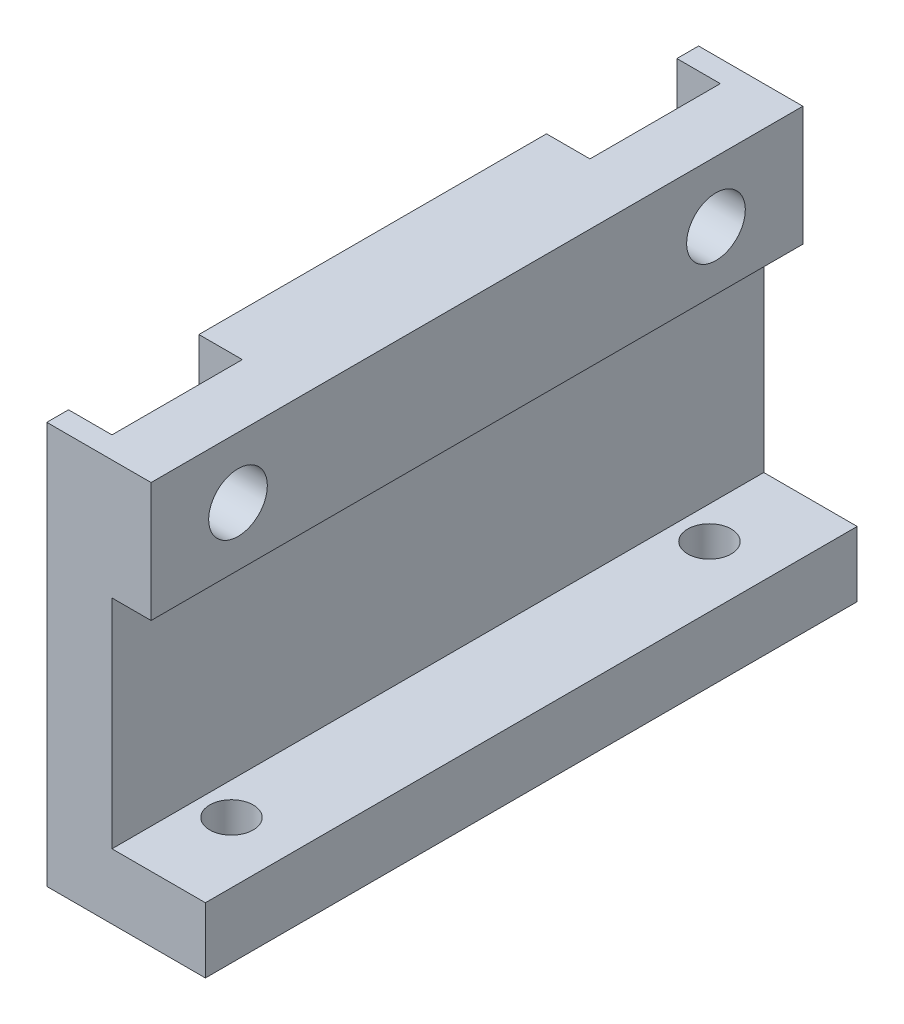
ISO-10303-21;
HEADER;
FILE_DESCRIPTION(('STEP AP214'),'2;1');
FILE_NAME('part.step','',(''),(''),'','','');
FILE_SCHEMA(('AUTOMOTIVE_DESIGN { 1 0 10303 214 1 1 1 1 }'));
ENDSEC;
DATA;
#1=APPLICATION_CONTEXT('core data for automotive mechanical design processes');
#2=APPLICATION_PROTOCOL_DEFINITION('international standard','automotive_design',2000,#1);
#3=PRODUCT_CONTEXT('',#1,'mechanical');
#4=PRODUCT('Part','Part','',(#3));
#5=PRODUCT_RELATED_PRODUCT_CATEGORY('part','',(#4));
#6=PRODUCT_DEFINITION_FORMATION('','',#4);
#7=PRODUCT_DEFINITION_CONTEXT('part definition',#1,'design');
#8=PRODUCT_DEFINITION('design','',#6,#7);
#9=PRODUCT_DEFINITION_SHAPE('','',#8);
#10=(LENGTH_UNIT() NAMED_UNIT(*) SI_UNIT(.MILLI.,.METRE.));
#11=(NAMED_UNIT(*) PLANE_ANGLE_UNIT() SI_UNIT($,.RADIAN.));
#12=(NAMED_UNIT(*) SI_UNIT($,.STERADIAN.) SOLID_ANGLE_UNIT());
#13=UNCERTAINTY_MEASURE_WITH_UNIT(LENGTH_MEASURE(1.E-05),#10,'distance_accuracy_value','');
#14=(GEOMETRIC_REPRESENTATION_CONTEXT(3) GLOBAL_UNCERTAINTY_ASSIGNED_CONTEXT((#13)) GLOBAL_UNIT_ASSIGNED_CONTEXT((#10,
#11,#12)) REPRESENTATION_CONTEXT('',''));
#15=CARTESIAN_POINT('',(0.,0.,0.));
#16=DIRECTION('',(0.,0.,1.));
#17=DIRECTION('',(1.,0.,0.));
#18=AXIS2_PLACEMENT_3D('',#15,#16,#17);
#19=CARTESIAN_POINT('',(7.301,15.7,4.));
#20=DIRECTION('',(-1.,0.,0.));
#21=DIRECTION('',(0.,-1.,0.));
#22=AXIS2_PLACEMENT_3D('',#19,#20,#21);
#23=CYLINDRICAL_SURFACE('',#22,1.35);
#24=CARTESIAN_POINT('',(4.8,15.7,4.));
#25=DIRECTION('',(-1.,0.,0.));
#26=DIRECTION('',(0.,-1.,0.));
#27=AXIS2_PLACEMENT_3D('',#24,#25,#26);
#28=CIRCLE('',#27,1.35);
#29=CARTESIAN_POINT('',(4.8,14.35,4.));
#30=VERTEX_POINT('',#29);
#31=EDGE_CURVE('E202',#30,#30,#28,.F.);
#32=ORIENTED_EDGE('',*,*,#31,.T.);
#33=EDGE_LOOP('',(#32));
#34=FACE_BOUND('',#33,.T.);
#35=CARTESIAN_POINT('',(2.,15.7,4.));
#36=DIRECTION('',(-1.,0.,0.));
#37=DIRECTION('',(0.,-1.,0.));
#38=AXIS2_PLACEMENT_3D('',#35,#36,#37);
#39=CIRCLE('',#38,1.35);
#40=CARTESIAN_POINT('',(2.,14.35,4.));
#41=VERTEX_POINT('',#40);
#42=EDGE_CURVE('E175',#41,#41,#39,.F.);
#43=ORIENTED_EDGE('',*,*,#42,.F.);
#44=EDGE_LOOP('',(#43));
#45=FACE_BOUND('',#44,.T.);
#46=ADVANCED_FACE('F34',(#34,#45),#23,.F.);
#47=CARTESIAN_POINT('',(7.301,15.7,26.));
#48=DIRECTION('',(-1.,0.,0.));
#49=DIRECTION('',(0.,-1.,0.));
#50=AXIS2_PLACEMENT_3D('',#47,#48,#49);
#51=CYLINDRICAL_SURFACE('',#50,1.35);
#52=CARTESIAN_POINT('',(4.8,15.7,26.));
#53=DIRECTION('',(-1.,0.,0.));
#54=DIRECTION('',(0.,-1.,0.));
#55=AXIS2_PLACEMENT_3D('',#52,#53,#54);
#56=CIRCLE('',#55,1.35);
#57=CARTESIAN_POINT('',(4.8,14.35,26.));
#58=VERTEX_POINT('',#57);
#59=EDGE_CURVE('E199',#58,#58,#56,.F.);
#60=ORIENTED_EDGE('',*,*,#59,.T.);
#61=EDGE_LOOP('',(#60));
#62=FACE_BOUND('',#61,.T.);
#63=CARTESIAN_POINT('',(2.,15.7,26.));
#64=DIRECTION('',(-1.,0.,0.));
#65=DIRECTION('',(0.,-1.,0.));
#66=AXIS2_PLACEMENT_3D('',#63,#64,#65);
#67=CIRCLE('',#66,1.35);
#68=CARTESIAN_POINT('',(2.,14.35,26.));
#69=VERTEX_POINT('',#68);
#70=EDGE_CURVE('E195',#69,#69,#67,.F.);
#71=ORIENTED_EDGE('',*,*,#70,.F.);
#72=EDGE_LOOP('',(#71));
#73=FACE_BOUND('',#72,.T.);
#74=ADVANCED_FACE('F339',(#62,#73),#51,.F.);
#75=CARTESIAN_POINT('',(0.,18.5,30.));
#76=DIRECTION('',(1.,0.,0.));
#77=DIRECTION('',(0.,1.,0.));
#78=AXIS2_PLACEMENT_3D('',#75,#76,#77);
#79=PLANE('',#78);
#80=CARTESIAN_POINT('',(0.,15.7,4.));
#81=DIRECTION('',(-1.,0.,0.));
#82=DIRECTION('',(0.,-1.,0.));
#83=AXIS2_PLACEMENT_3D('',#80,#81,#82);
#84=CIRCLE('',#83,3.);
#85=CARTESIAN_POINT('',(0.,15.7,0.999999999999997));
#86=VERTEX_POINT('',#85);
#87=CARTESIAN_POINT('',(0.,15.7,7.));
#88=VERTEX_POINT('',#87);
#89=EDGE_CURVE('E154',#86,#88,#84,.T.);
#90=ORIENTED_EDGE('',*,*,#89,.F.);
#91=DIRECTION('',(0.,-1.,0.));
#92=VECTOR('',#91,1.);
#93=CARTESIAN_POINT('',(0.,15.7,0.999999999999997));
#94=LINE('',#93,#92);
#95=CARTESIAN_POINT('',(0.,18.5,0.999999999999997));
#96=VERTEX_POINT('',#95);
#97=EDGE_CURVE('E167',#96,#86,#94,.T.);
#98=ORIENTED_EDGE('',*,*,#97,.F.);
#99=DIRECTION('',(0.,0.,-1.));
#100=VECTOR('',#99,1.);
#101=CARTESIAN_POINT('',(0.,18.5,30.));
#102=LINE('',#101,#100);
#103=CARTESIAN_POINT('',(0.,18.5,0.));
#104=VERTEX_POINT('',#103);
#105=EDGE_CURVE('E236',#96,#104,#102,.T.);
#106=ORIENTED_EDGE('',*,*,#105,.T.);
#107=DIRECTION('',(0.,-1.,0.));
#108=VECTOR('',#107,1.);
#109=CARTESIAN_POINT('',(0.,18.5,0.));
#110=LINE('',#109,#108);
#111=CARTESIAN_POINT('',(0.,0.,0.));
#112=VERTEX_POINT('',#111);
#113=EDGE_CURVE('E215',#104,#112,#110,.T.);
#114=ORIENTED_EDGE('',*,*,#113,.T.);
#115=DIRECTION('',(0.,0.,-1.));
#116=VECTOR('',#115,1.);
#117=CARTESIAN_POINT('',(0.,0.,30.));
#118=LINE('',#117,#116);
#119=CARTESIAN_POINT('',(0.,0.,30.));
#120=VERTEX_POINT('',#119);
#121=EDGE_CURVE('E275',#120,#112,#118,.T.);
#122=ORIENTED_EDGE('',*,*,#121,.F.);
#123=DIRECTION('',(0.,-1.,0.));
#124=VECTOR('',#123,1.);
#125=CARTESIAN_POINT('',(0.,18.5,30.));
#126=LINE('',#125,#124);
#127=CARTESIAN_POINT('',(0.,18.5,30.));
#128=VERTEX_POINT('',#127);
#129=EDGE_CURVE('E218',#128,#120,#126,.T.);
#130=ORIENTED_EDGE('',*,*,#129,.F.);
#131=CARTESIAN_POINT('',(0.,18.5,29.));
#132=VERTEX_POINT('',#131);
#133=EDGE_CURVE('E253',#128,#132,#102,.T.);
#134=ORIENTED_EDGE('',*,*,#133,.T.);
#135=DIRECTION('',(0.,1.,0.));
#136=VECTOR('',#135,1.);
#137=CARTESIAN_POINT('',(0.,20.0068838464239,29.));
#138=LINE('',#137,#136);
#139=CARTESIAN_POINT('',(0.,15.7,29.));
#140=VERTEX_POINT('',#139);
#141=EDGE_CURVE('E189',#140,#132,#138,.T.);
#142=ORIENTED_EDGE('',*,*,#141,.F.);
#143=CARTESIAN_POINT('',(0.,15.7,26.));
#144=DIRECTION('',(-1.,0.,0.));
#145=DIRECTION('',(0.,-1.,0.));
#146=AXIS2_PLACEMENT_3D('',#143,#144,#145);
#147=CIRCLE('',#146,3.);
#148=CARTESIAN_POINT('',(0.,15.7,23.));
#149=VERTEX_POINT('',#148);
#150=EDGE_CURVE('E179',#149,#140,#147,.T.);
#151=ORIENTED_EDGE('',*,*,#150,.F.);
#152=DIRECTION('',(0.,-1.,0.));
#153=VECTOR('',#152,1.);
#154=CARTESIAN_POINT('',(0.,15.7,23.));
#155=LINE('',#154,#153);
#156=CARTESIAN_POINT('',(0.,18.5,23.));
#157=VERTEX_POINT('',#156);
#158=EDGE_CURVE('E182',#157,#149,#155,.T.);
#159=ORIENTED_EDGE('',*,*,#158,.F.);
#160=CARTESIAN_POINT('',(0.,18.5,7.));
#161=VERTEX_POINT('',#160);
#162=EDGE_CURVE('E257',#157,#161,#102,.T.);
#163=ORIENTED_EDGE('',*,*,#162,.T.);
#164=DIRECTION('',(0.,1.,0.));
#165=VECTOR('',#164,1.);
#166=CARTESIAN_POINT('',(0.,15.7,7.));
#167=LINE('',#166,#165);
#168=EDGE_CURVE('E169',#88,#161,#167,.T.);
#169=ORIENTED_EDGE('',*,*,#168,.F.);
#170=EDGE_LOOP('',(#90,#98,#106,#114,#122,#130,#134,#142,#151,#159,#163,#169));
#171=FACE_BOUND('',#170,.T.);
#172=ADVANCED_FACE('F36',(#171),#79,.F.);
#173=CARTESIAN_POINT('',(0.,0.,30.));
#174=DIRECTION('',(0.,1.,0.));
#175=DIRECTION('',(0.,0.,1.));
#176=AXIS2_PLACEMENT_3D('',#173,#174,#175);
#177=PLANE('',#176);
#178=CARTESIAN_POINT('',(4.5,0.,4.));
#179=DIRECTION('',(0.,-1.,0.));
#180=DIRECTION('',(-1.,0.,0.));
#181=AXIS2_PLACEMENT_3D('',#178,#179,#180);
#182=CIRCLE('',#181,1.);
#183=CARTESIAN_POINT('',(3.5,0.,4.));
#184=VERTEX_POINT('',#183);
#185=EDGE_CURVE('E205',#184,#184,#182,.T.);
#186=ORIENTED_EDGE('',*,*,#185,.F.);
#187=EDGE_LOOP('',(#186));
#188=FACE_BOUND('',#187,.T.);
#189=CARTESIAN_POINT('',(4.5,0.,26.));
#190=DIRECTION('',(0.,-1.,0.));
#191=DIRECTION('',(1.,0.,0.));
#192=AXIS2_PLACEMENT_3D('',#189,#190,#191);
#193=CIRCLE('',#192,1.);
#194=CARTESIAN_POINT('',(5.5,0.,26.));
#195=VERTEX_POINT('',#194);
#196=EDGE_CURVE('E209',#195,#195,#193,.T.);
#197=ORIENTED_EDGE('',*,*,#196,.F.);
#198=EDGE_LOOP('',(#197));
#199=FACE_BOUND('',#198,.T.);
#200=DIRECTION('',(1.,0.,0.));
#201=VECTOR('',#200,1.);
#202=CARTESIAN_POINT('',(0.,0.,0.));
#203=LINE('',#202,#201);
#204=CARTESIAN_POINT('',(7.3,0.,0.));
#205=VERTEX_POINT('',#204);
#206=EDGE_CURVE('E239',#112,#205,#203,.T.);
#207=ORIENTED_EDGE('',*,*,#206,.T.);
#208=DIRECTION('',(0.,0.,-1.));
#209=VECTOR('',#208,1.);
#210=CARTESIAN_POINT('',(7.3,0.,30.));
#211=LINE('',#210,#209);
#212=CARTESIAN_POINT('',(7.3,0.,30.));
#213=VERTEX_POINT('',#212);
#214=EDGE_CURVE('E272',#213,#205,#211,.T.);
#215=ORIENTED_EDGE('',*,*,#214,.F.);
#216=DIRECTION('',(1.,0.,0.));
#217=VECTOR('',#216,1.);
#218=CARTESIAN_POINT('',(0.,0.,30.));
#219=LINE('',#218,#217);
#220=EDGE_CURVE('E221',#120,#213,#219,.T.);
#221=ORIENTED_EDGE('',*,*,#220,.F.);
#222=ORIENTED_EDGE('',*,*,#121,.T.);
#223=EDGE_LOOP('',(#207,#215,#221,#222));
#224=FACE_BOUND('',#223,.T.);
#225=ADVANCED_FACE('F308',(#188,#199,#224),#177,.F.);
#226=CARTESIAN_POINT('',(7.3,0.,30.));
#227=DIRECTION('',(-1.,0.,0.));
#228=DIRECTION('',(0.,-1.,0.));
#229=AXIS2_PLACEMENT_3D('',#226,#227,#228);
#230=PLANE('',#229);
#231=DIRECTION('',(0.,1.,0.));
#232=VECTOR('',#231,1.);
#233=CARTESIAN_POINT('',(7.3,0.,0.));
#234=LINE('',#233,#232);
#235=CARTESIAN_POINT('',(7.3,3.,0.));
#236=VERTEX_POINT('',#235);
#237=EDGE_CURVE('E241',#205,#236,#234,.T.);
#238=ORIENTED_EDGE('',*,*,#237,.T.);
#239=DIRECTION('',(0.,0.,-1.));
#240=VECTOR('',#239,1.);
#241=CARTESIAN_POINT('',(7.3,3.,30.));
#242=LINE('',#241,#240);
#243=CARTESIAN_POINT('',(7.3,3.,30.));
#244=VERTEX_POINT('',#243);
#245=EDGE_CURVE('E269',#244,#236,#242,.T.);
#246=ORIENTED_EDGE('',*,*,#245,.F.);
#247=DIRECTION('',(0.,1.,0.));
#248=VECTOR('',#247,1.);
#249=CARTESIAN_POINT('',(7.3,0.,30.));
#250=LINE('',#249,#248);
#251=EDGE_CURVE('E224',#213,#244,#250,.T.);
#252=ORIENTED_EDGE('',*,*,#251,.F.);
#253=ORIENTED_EDGE('',*,*,#214,.T.);
#254=EDGE_LOOP('',(#238,#246,#252,#253));
#255=FACE_BOUND('',#254,.T.);
#256=ADVANCED_FACE('F378',(#255),#230,.F.);
#257=CARTESIAN_POINT('',(7.3,3.,30.));
#258=DIRECTION('',(0.,-1.,0.));
#259=DIRECTION('',(1.,0.,0.));
#260=AXIS2_PLACEMENT_3D('',#257,#258,#259);
#261=PLANE('',#260);
#262=CARTESIAN_POINT('',(4.5,3.,4.));
#263=DIRECTION('',(0.,-1.,0.));
#264=DIRECTION('',(1.,0.,0.));
#265=AXIS2_PLACEMENT_3D('',#262,#263,#264);
#266=CIRCLE('',#265,1.);
#267=CARTESIAN_POINT('',(5.5,3.,4.));
#268=VERTEX_POINT('',#267);
#269=EDGE_CURVE('E206',#268,#268,#266,.F.);
#270=ORIENTED_EDGE('',*,*,#269,.F.);
#271=EDGE_LOOP('',(#270));
#272=FACE_BOUND('',#271,.T.);
#273=CARTESIAN_POINT('',(4.5,3.,26.));
#274=DIRECTION('',(0.,-1.,0.));
#275=DIRECTION('',(1.,0.,0.));
#276=AXIS2_PLACEMENT_3D('',#273,#274,#275);
#277=CIRCLE('',#276,1.);
#278=CARTESIAN_POINT('',(5.5,3.,26.));
#279=VERTEX_POINT('',#278);
#280=EDGE_CURVE('E212',#279,#279,#277,.F.);
#281=ORIENTED_EDGE('',*,*,#280,.F.);
#282=EDGE_LOOP('',(#281));
#283=FACE_BOUND('',#282,.T.);
#284=DIRECTION('',(-1.,0.,0.));
#285=VECTOR('',#284,1.);
#286=CARTESIAN_POINT('',(7.3,3.,0.));
#287=LINE('',#286,#285);
#288=CARTESIAN_POINT('',(3.,3.,0.));
#289=VERTEX_POINT('',#288);
#290=EDGE_CURVE('E243',#236,#289,#287,.T.);
#291=ORIENTED_EDGE('',*,*,#290,.T.);
#292=DIRECTION('',(0.,0.,-1.));
#293=VECTOR('',#292,1.);
#294=CARTESIAN_POINT('',(3.,3.,30.));
#295=LINE('',#294,#293);
#296=CARTESIAN_POINT('',(3.,3.,30.));
#297=VERTEX_POINT('',#296);
#298=EDGE_CURVE('E266',#297,#289,#295,.T.);
#299=ORIENTED_EDGE('',*,*,#298,.F.);
#300=DIRECTION('',(-1.,0.,0.));
#301=VECTOR('',#300,1.);
#302=CARTESIAN_POINT('',(7.3,3.,30.));
#303=LINE('',#302,#301);
#304=EDGE_CURVE('E226',#244,#297,#303,.T.);
#305=ORIENTED_EDGE('',*,*,#304,.F.);
#306=ORIENTED_EDGE('',*,*,#245,.T.);
#307=EDGE_LOOP('',(#291,#299,#305,#306));
#308=FACE_BOUND('',#307,.T.);
#309=ADVANCED_FACE('F374',(#272,#283,#308),#261,.F.);
#310=CARTESIAN_POINT('',(3.,3.,30.));
#311=DIRECTION('',(-1.,0.,0.));
#312=DIRECTION('',(0.,0.,1.));
#313=AXIS2_PLACEMENT_3D('',#310,#311,#312);
#314=PLANE('',#313);
#315=DIRECTION('',(0.,1.,0.));
#316=VECTOR('',#315,1.);
#317=CARTESIAN_POINT('',(3.,3.,0.));
#318=LINE('',#317,#316);
#319=CARTESIAN_POINT('',(3.,13.,0.));
#320=VERTEX_POINT('',#319);
#321=EDGE_CURVE('E245',#289,#320,#318,.T.);
#322=ORIENTED_EDGE('',*,*,#321,.T.);
#323=DIRECTION('',(0.,0.,-1.));
#324=VECTOR('',#323,1.);
#325=CARTESIAN_POINT('',(3.,13.,30.));
#326=LINE('',#325,#324);
#327=CARTESIAN_POINT('',(3.,13.,30.));
#328=VERTEX_POINT('',#327);
#329=EDGE_CURVE('E263',#328,#320,#326,.T.);
#330=ORIENTED_EDGE('',*,*,#329,.F.);
#331=DIRECTION('',(0.,1.,0.));
#332=VECTOR('',#331,1.);
#333=CARTESIAN_POINT('',(3.,3.,30.));
#334=LINE('',#333,#332);
#335=EDGE_CURVE('E228',#297,#328,#334,.T.);
#336=ORIENTED_EDGE('',*,*,#335,.F.);
#337=ORIENTED_EDGE('',*,*,#298,.T.);
#338=EDGE_LOOP('',(#322,#330,#336,#337));
#339=FACE_BOUND('',#338,.T.);
#340=ADVANCED_FACE('F370',(#339),#314,.F.);
#341=CARTESIAN_POINT('',(4.8,13.,30.));
#342=DIRECTION('',(0.,1.,0.));
#343=DIRECTION('',(0.,0.,1.));
#344=AXIS2_PLACEMENT_3D('',#341,#342,#343);
#345=PLANE('',#344);
#346=DIRECTION('',(1.,0.,0.));
#347=VECTOR('',#346,1.);
#348=CARTESIAN_POINT('',(4.8,13.,0.));
#349=LINE('',#348,#347);
#350=CARTESIAN_POINT('',(4.8,13.,0.));
#351=VERTEX_POINT('',#350);
#352=EDGE_CURVE('E247',#320,#351,#349,.T.);
#353=ORIENTED_EDGE('',*,*,#352,.T.);
#354=DIRECTION('',(0.,0.,-1.));
#355=VECTOR('',#354,1.);
#356=CARTESIAN_POINT('',(4.8,13.,30.));
#357=LINE('',#356,#355);
#358=CARTESIAN_POINT('',(4.8,13.,30.));
#359=VERTEX_POINT('',#358);
#360=EDGE_CURVE('E260',#359,#351,#357,.T.);
#361=ORIENTED_EDGE('',*,*,#360,.F.);
#362=DIRECTION('',(1.,0.,0.));
#363=VECTOR('',#362,1.);
#364=CARTESIAN_POINT('',(4.8,13.,30.));
#365=LINE('',#364,#363);
#366=EDGE_CURVE('E230',#328,#359,#365,.T.);
#367=ORIENTED_EDGE('',*,*,#366,.F.);
#368=ORIENTED_EDGE('',*,*,#329,.T.);
#369=EDGE_LOOP('',(#353,#361,#367,#368));
#370=FACE_BOUND('',#369,.T.);
#371=ADVANCED_FACE('F366',(#370),#345,.F.);
#372=CARTESIAN_POINT('',(4.8,18.5,30.));
#373=DIRECTION('',(-1.,0.,0.));
#374=DIRECTION('',(0.,-1.,0.));
#375=AXIS2_PLACEMENT_3D('',#372,#373,#374);
#376=PLANE('',#375);
#377=ORIENTED_EDGE('',*,*,#59,.F.);
#378=EDGE_LOOP('',(#377));
#379=FACE_BOUND('',#378,.T.);
#380=ORIENTED_EDGE('',*,*,#31,.F.);
#381=EDGE_LOOP('',(#380));
#382=FACE_BOUND('',#381,.T.);
#383=DIRECTION('',(0.,1.,0.));
#384=VECTOR('',#383,1.);
#385=CARTESIAN_POINT('',(4.8,18.5,0.));
#386=LINE('',#385,#384);
#387=CARTESIAN_POINT('',(4.8,18.5,0.));
#388=VERTEX_POINT('',#387);
#389=EDGE_CURVE('E249',#351,#388,#386,.T.);
#390=ORIENTED_EDGE('',*,*,#389,.T.);
#391=DIRECTION('',(0.,0.,-1.));
#392=VECTOR('',#391,1.);
#393=CARTESIAN_POINT('',(4.8,18.5,30.));
#394=LINE('',#393,#392);
#395=CARTESIAN_POINT('',(4.8,18.5,30.));
#396=VERTEX_POINT('',#395);
#397=EDGE_CURVE('E256',#396,#388,#394,.T.);
#398=ORIENTED_EDGE('',*,*,#397,.F.);
#399=DIRECTION('',(0.,1.,0.));
#400=VECTOR('',#399,1.);
#401=CARTESIAN_POINT('',(4.8,18.5,30.));
#402=LINE('',#401,#400);
#403=EDGE_CURVE('E232',#359,#396,#402,.T.);
#404=ORIENTED_EDGE('',*,*,#403,.F.);
#405=ORIENTED_EDGE('',*,*,#360,.T.);
#406=EDGE_LOOP('',(#390,#398,#404,#405));
#407=FACE_BOUND('',#406,.T.);
#408=ADVANCED_FACE('F363',(#379,#382,#407),#376,.F.);
#409=CARTESIAN_POINT('',(4.8,18.5,30.));
#410=DIRECTION('',(0.,-1.,0.));
#411=DIRECTION('',(0.,0.,-1.));
#412=AXIS2_PLACEMENT_3D('',#409,#410,#411);
#413=PLANE('',#412);
#414=ORIENTED_EDGE('',*,*,#105,.F.);
#415=DIRECTION('',(1.,0.,0.));
#416=VECTOR('',#415,1.);
#417=CARTESIAN_POINT('',(4.8,18.5,0.999999999999997));
#418=LINE('',#417,#416);
#419=CARTESIAN_POINT('',(2.,18.5,0.999999999999997));
#420=VERTEX_POINT('',#419);
#421=EDGE_CURVE('E11',#96,#420,#418,.T.);
#422=ORIENTED_EDGE('',*,*,#421,.T.);
#423=DIRECTION('',(0.,0.,-1.));
#424=VECTOR('',#423,1.);
#425=CARTESIAN_POINT('',(2.,18.5,30.));
#426=LINE('',#425,#424);
#427=CARTESIAN_POINT('',(2.,18.5,7.));
#428=VERTEX_POINT('',#427);
#429=EDGE_CURVE('E177',#428,#420,#426,.T.);
#430=ORIENTED_EDGE('',*,*,#429,.F.);
#431=DIRECTION('',(-1.,0.,0.));
#432=VECTOR('',#431,1.);
#433=CARTESIAN_POINT('',(4.8,18.5,7.));
#434=LINE('',#433,#432);
#435=EDGE_CURVE('E42',#428,#161,#434,.T.);
#436=ORIENTED_EDGE('',*,*,#435,.T.);
#437=ORIENTED_EDGE('',*,*,#162,.F.);
#438=DIRECTION('',(1.,0.,0.));
#439=VECTOR('',#438,1.);
#440=CARTESIAN_POINT('',(4.8,18.5,23.));
#441=LINE('',#440,#439);
#442=CARTESIAN_POINT('',(2.,18.5,23.));
#443=VERTEX_POINT('',#442);
#444=EDGE_CURVE('E283',#157,#443,#441,.T.);
#445=ORIENTED_EDGE('',*,*,#444,.T.);
#446=DIRECTION('',(0.,0.,-1.));
#447=VECTOR('',#446,1.);
#448=CARTESIAN_POINT('',(2.,18.5,30.));
#449=LINE('',#448,#447);
#450=CARTESIAN_POINT('',(2.,18.5,29.));
#451=VERTEX_POINT('',#450);
#452=EDGE_CURVE('E197',#451,#443,#449,.T.);
#453=ORIENTED_EDGE('',*,*,#452,.F.);
#454=DIRECTION('',(-1.,0.,0.));
#455=VECTOR('',#454,1.);
#456=CARTESIAN_POINT('',(4.8,18.5,29.));
#457=LINE('',#456,#455);
#458=EDGE_CURVE('E278',#451,#132,#457,.T.);
#459=ORIENTED_EDGE('',*,*,#458,.T.);
#460=ORIENTED_EDGE('',*,*,#133,.F.);
#461=DIRECTION('',(-1.,0.,0.));
#462=VECTOR('',#461,1.);
#463=CARTESIAN_POINT('',(4.8,18.5,30.));
#464=LINE('',#463,#462);
#465=EDGE_CURVE('E234',#396,#128,#464,.T.);
#466=ORIENTED_EDGE('',*,*,#465,.F.);
#467=ORIENTED_EDGE('',*,*,#397,.T.);
#468=DIRECTION('',(-1.,0.,0.));
#469=VECTOR('',#468,1.);
#470=CARTESIAN_POINT('',(4.8,18.5,0.));
#471=LINE('',#470,#469);
#472=EDGE_CURVE('E222',#388,#104,#471,.T.);
#473=ORIENTED_EDGE('',*,*,#472,.T.);
#474=EDGE_LOOP('',(#414,#422,#430,#436,#437,#445,#453,#459,#460,#466,#467,#473));
#475=FACE_BOUND('',#474,.T.);
#476=ADVANCED_FACE('F291',(#475),#413,.F.);
#477=CARTESIAN_POINT('',(0.,0.,30.));
#478=DIRECTION('',(0.,0.,1.));
#479=DIRECTION('',(1.,0.,0.));
#480=AXIS2_PLACEMENT_3D('',#477,#478,#479);
#481=PLANE('',#480);
#482=ORIENTED_EDGE('',*,*,#129,.T.);
#483=ORIENTED_EDGE('',*,*,#220,.T.);
#484=ORIENTED_EDGE('',*,*,#251,.T.);
#485=ORIENTED_EDGE('',*,*,#304,.T.);
#486=ORIENTED_EDGE('',*,*,#335,.T.);
#487=ORIENTED_EDGE('',*,*,#366,.T.);
#488=ORIENTED_EDGE('',*,*,#403,.T.);
#489=ORIENTED_EDGE('',*,*,#465,.T.);
#490=EDGE_LOOP('',(#482,#483,#484,#485,#486,#487,#488,#489));
#491=FACE_BOUND('',#490,.T.);
#492=ADVANCED_FACE('F313',(#491),#481,.T.);
#493=CARTESIAN_POINT('',(0.,0.,0.));
#494=DIRECTION('',(0.,0.,1.));
#495=DIRECTION('',(1.,0.,0.));
#496=AXIS2_PLACEMENT_3D('',#493,#494,#495);
#497=PLANE('',#496);
#498=ORIENTED_EDGE('',*,*,#113,.F.);
#499=ORIENTED_EDGE('',*,*,#472,.F.);
#500=ORIENTED_EDGE('',*,*,#389,.F.);
#501=ORIENTED_EDGE('',*,*,#352,.F.);
#502=ORIENTED_EDGE('',*,*,#321,.F.);
#503=ORIENTED_EDGE('',*,*,#290,.F.);
#504=ORIENTED_EDGE('',*,*,#237,.F.);
#505=ORIENTED_EDGE('',*,*,#206,.F.);
#506=EDGE_LOOP('',(#498,#499,#500,#501,#502,#503,#504,#505));
#507=FACE_BOUND('',#506,.T.);
#508=ADVANCED_FACE('F303',(#507),#497,.F.);
#509=CARTESIAN_POINT('',(4.5,18.501,26.));
#510=DIRECTION('',(0.,-1.,0.));
#511=DIRECTION('',(1.,0.,0.));
#512=AXIS2_PLACEMENT_3D('',#509,#510,#511);
#513=CYLINDRICAL_SURFACE('',#512,1.);
#514=ORIENTED_EDGE('',*,*,#196,.T.);
#515=EDGE_LOOP('',(#514));
#516=FACE_BOUND('',#515,.T.);
#517=ORIENTED_EDGE('',*,*,#280,.T.);
#518=EDGE_LOOP('',(#517));
#519=FACE_BOUND('',#518,.T.);
#520=ADVANCED_FACE('F352',(#516,#519),#513,.F.);
#521=CARTESIAN_POINT('',(4.5,18.501,4.));
#522=DIRECTION('',(0.,-1.,0.));
#523=DIRECTION('',(1.,0.,0.));
#524=AXIS2_PLACEMENT_3D('',#521,#522,#523);
#525=CYLINDRICAL_SURFACE('',#524,1.);
#526=ORIENTED_EDGE('',*,*,#185,.T.);
#527=EDGE_LOOP('',(#526));
#528=FACE_BOUND('',#527,.T.);
#529=ORIENTED_EDGE('',*,*,#269,.T.);
#530=EDGE_LOOP('',(#529));
#531=FACE_BOUND('',#530,.T.);
#532=ADVANCED_FACE('F349',(#528,#531),#525,.F.);
#533=CARTESIAN_POINT('',(2.,15.7,23.));
#534=DIRECTION('',(0.,0.,-1.));
#535=DIRECTION('',(-1.,0.,0.));
#536=AXIS2_PLACEMENT_3D('',#533,#534,#535);
#537=PLANE('',#536);
#538=ORIENTED_EDGE('',*,*,#158,.T.);
#539=DIRECTION('',(-1.,0.,0.));
#540=VECTOR('',#539,1.);
#541=CARTESIAN_POINT('',(2.,15.7,23.));
#542=LINE('',#541,#540);
#543=CARTESIAN_POINT('',(2.,15.7,23.));
#544=VERTEX_POINT('',#543);
#545=EDGE_CURVE('E192',#544,#149,#542,.T.);
#546=ORIENTED_EDGE('',*,*,#545,.F.);
#547=DIRECTION('',(0.,-1.,0.));
#548=VECTOR('',#547,1.);
#549=CARTESIAN_POINT('',(2.,15.7,23.));
#550=LINE('',#549,#548);
#551=EDGE_CURVE('E184',#443,#544,#550,.T.);
#552=ORIENTED_EDGE('',*,*,#551,.F.);
#553=ORIENTED_EDGE('',*,*,#444,.F.);
#554=EDGE_LOOP('',(#538,#546,#552,#553));
#555=FACE_BOUND('',#554,.T.);
#556=ADVANCED_FACE('F324',(#555),#537,.F.);
#557=CARTESIAN_POINT('',(2.,20.0068838464239,29.));
#558=DIRECTION('',(0.,0.,1.));
#559=DIRECTION('',(1.,0.,0.));
#560=AXIS2_PLACEMENT_3D('',#557,#558,#559);
#561=PLANE('',#560);
#562=DIRECTION('',(0.,1.,0.));
#563=VECTOR('',#562,1.);
#564=CARTESIAN_POINT('',(2.,20.0068838464239,29.));
#565=LINE('',#564,#563);
#566=CARTESIAN_POINT('',(2.,15.7,29.));
#567=VERTEX_POINT('',#566);
#568=EDGE_CURVE('E57',#567,#451,#565,.T.);
#569=ORIENTED_EDGE('',*,*,#568,.F.);
#570=DIRECTION('',(-1.,0.,0.));
#571=VECTOR('',#570,1.);
#572=CARTESIAN_POINT('',(2.,15.7,29.));
#573=LINE('',#572,#571);
#574=EDGE_CURVE('E186',#567,#140,#573,.T.);
#575=ORIENTED_EDGE('',*,*,#574,.T.);
#576=ORIENTED_EDGE('',*,*,#141,.T.);
#577=ORIENTED_EDGE('',*,*,#458,.F.);
#578=EDGE_LOOP('',(#569,#575,#576,#577));
#579=FACE_BOUND('',#578,.T.);
#580=ADVANCED_FACE('F317',(#579),#561,.F.);
#581=CARTESIAN_POINT('',(2.,15.7,26.));
#582=DIRECTION('',(-1.,0.,0.));
#583=DIRECTION('',(0.,-1.,0.));
#584=AXIS2_PLACEMENT_3D('',#581,#582,#583);
#585=PLANE('',#584);
#586=ORIENTED_EDGE('',*,*,#70,.T.);
#587=EDGE_LOOP('',(#586));
#588=FACE_BOUND('',#587,.T.);
#589=ORIENTED_EDGE('',*,*,#452,.T.);
#590=ORIENTED_EDGE('',*,*,#551,.T.);
#591=CARTESIAN_POINT('',(2.,15.7,26.));
#592=DIRECTION('',(-1.,0.,0.));
#593=DIRECTION('',(0.,-1.,0.));
#594=AXIS2_PLACEMENT_3D('',#591,#592,#593);
#595=CIRCLE('',#594,3.);
#596=EDGE_CURVE('E180',#544,#567,#595,.T.);
#597=ORIENTED_EDGE('',*,*,#596,.T.);
#598=ORIENTED_EDGE('',*,*,#568,.T.);
#599=EDGE_LOOP('',(#589,#590,#597,#598));
#600=FACE_BOUND('',#599,.T.);
#601=ADVANCED_FACE('F325',(#588,#600),#585,.T.);
#602=CARTESIAN_POINT('',(2.,15.7,26.));
#603=DIRECTION('',(-1.,0.,0.));
#604=DIRECTION('',(0.,-1.,0.));
#605=AXIS2_PLACEMENT_3D('',#602,#603,#604);
#606=CYLINDRICAL_SURFACE('',#605,3.);
#607=ORIENTED_EDGE('',*,*,#150,.T.);
#608=ORIENTED_EDGE('',*,*,#574,.F.);
#609=ORIENTED_EDGE('',*,*,#596,.F.);
#610=ORIENTED_EDGE('',*,*,#545,.T.);
#611=EDGE_LOOP('',(#607,#608,#609,#610));
#612=FACE_BOUND('',#611,.T.);
#613=ADVANCED_FACE('F319',(#612),#606,.F.);
#614=CARTESIAN_POINT('',(2.,15.7,0.999999999999997));
#615=DIRECTION('',(0.,0.,-1.));
#616=DIRECTION('',(-1.,0.,0.));
#617=AXIS2_PLACEMENT_3D('',#614,#615,#616);
#618=PLANE('',#617);
#619=ORIENTED_EDGE('',*,*,#97,.T.);
#620=DIRECTION('',(-1.,0.,0.));
#621=VECTOR('',#620,1.);
#622=CARTESIAN_POINT('',(2.,15.7,0.999999999999997));
#623=LINE('',#622,#621);
#624=CARTESIAN_POINT('',(2.,15.7,0.999999999999997));
#625=VERTEX_POINT('',#624);
#626=EDGE_CURVE('E157',#625,#86,#623,.T.);
#627=ORIENTED_EDGE('',*,*,#626,.F.);
#628=DIRECTION('',(0.,-1.,0.));
#629=VECTOR('',#628,1.);
#630=CARTESIAN_POINT('',(2.,15.7,0.999999999999997));
#631=LINE('',#630,#629);
#632=EDGE_CURVE('E158',#420,#625,#631,.T.);
#633=ORIENTED_EDGE('',*,*,#632,.F.);
#634=ORIENTED_EDGE('',*,*,#421,.F.);
#635=EDGE_LOOP('',(#619,#627,#633,#634));
#636=FACE_BOUND('',#635,.T.);
#637=ADVANCED_FACE('F333',(#636),#618,.F.);
#638=CARTESIAN_POINT('',(2.,15.7,7.));
#639=DIRECTION('',(0.,0.,1.));
#640=DIRECTION('',(1.,0.,0.));
#641=AXIS2_PLACEMENT_3D('',#638,#639,#640);
#642=PLANE('',#641);
#643=DIRECTION('',(0.,1.,0.));
#644=VECTOR('',#643,1.);
#645=CARTESIAN_POINT('',(2.,15.7,7.));
#646=LINE('',#645,#644);
#647=CARTESIAN_POINT('',(2.,15.7,7.));
#648=VERTEX_POINT('',#647);
#649=EDGE_CURVE('E49',#648,#428,#646,.T.);
#650=ORIENTED_EDGE('',*,*,#649,.F.);
#651=DIRECTION('',(-1.,0.,0.));
#652=VECTOR('',#651,1.);
#653=CARTESIAN_POINT('',(2.,15.7,7.));
#654=LINE('',#653,#652);
#655=EDGE_CURVE('E149',#648,#88,#654,.T.);
#656=ORIENTED_EDGE('',*,*,#655,.T.);
#657=ORIENTED_EDGE('',*,*,#168,.T.);
#658=ORIENTED_EDGE('',*,*,#435,.F.);
#659=EDGE_LOOP('',(#650,#656,#657,#658));
#660=FACE_BOUND('',#659,.T.);
#661=ADVANCED_FACE('F160',(#660),#642,.F.);
#662=CARTESIAN_POINT('',(2.,15.7,4.));
#663=DIRECTION('',(-1.,0.,0.));
#664=DIRECTION('',(0.,-1.,0.));
#665=AXIS2_PLACEMENT_3D('',#662,#663,#664);
#666=PLANE('',#665);
#667=ORIENTED_EDGE('',*,*,#42,.T.);
#668=EDGE_LOOP('',(#667));
#669=FACE_BOUND('',#668,.T.);
#670=ORIENTED_EDGE('',*,*,#429,.T.);
#671=ORIENTED_EDGE('',*,*,#632,.T.);
#672=CARTESIAN_POINT('',(2.,15.7,4.));
#673=DIRECTION('',(-1.,0.,0.));
#674=DIRECTION('',(0.,-1.,0.));
#675=AXIS2_PLACEMENT_3D('',#672,#673,#674);
#676=CIRCLE('',#675,3.);
#677=EDGE_CURVE('E152',#625,#648,#676,.T.);
#678=ORIENTED_EDGE('',*,*,#677,.T.);
#679=ORIENTED_EDGE('',*,*,#649,.T.);
#680=EDGE_LOOP('',(#670,#671,#678,#679));
#681=FACE_BOUND('',#680,.T.);
#682=ADVANCED_FACE('F164',(#669,#681),#666,.T.);
#683=CARTESIAN_POINT('',(2.,15.7,4.));
#684=DIRECTION('',(-1.,0.,0.));
#685=DIRECTION('',(0.,-1.,0.));
#686=AXIS2_PLACEMENT_3D('',#683,#684,#685);
#687=CYLINDRICAL_SURFACE('',#686,3.);
#688=ORIENTED_EDGE('',*,*,#89,.T.);
#689=ORIENTED_EDGE('',*,*,#655,.F.);
#690=ORIENTED_EDGE('',*,*,#677,.F.);
#691=ORIENTED_EDGE('',*,*,#626,.T.);
#692=EDGE_LOOP('',(#688,#689,#690,#691));
#693=FACE_BOUND('',#692,.T.);
#694=ADVANCED_FACE('F150',(#693),#687,.F.);
#695=CLOSED_SHELL('',(#46,#74,#172,#225,#256,#309,#340,#371,#408,#476,#492,#508,#520,#532,#556,
#580,#601,#613,#637,#661,#682,#694));
#696=MANIFOLD_SOLID_BREP('B2',#695);
#697=ADVANCED_BREP_SHAPE_REPRESENTATION('',(#18,#696),#14);
#698=SHAPE_DEFINITION_REPRESENTATION(#9,#697);
ENDSEC;
END-ISO-10303-21;
